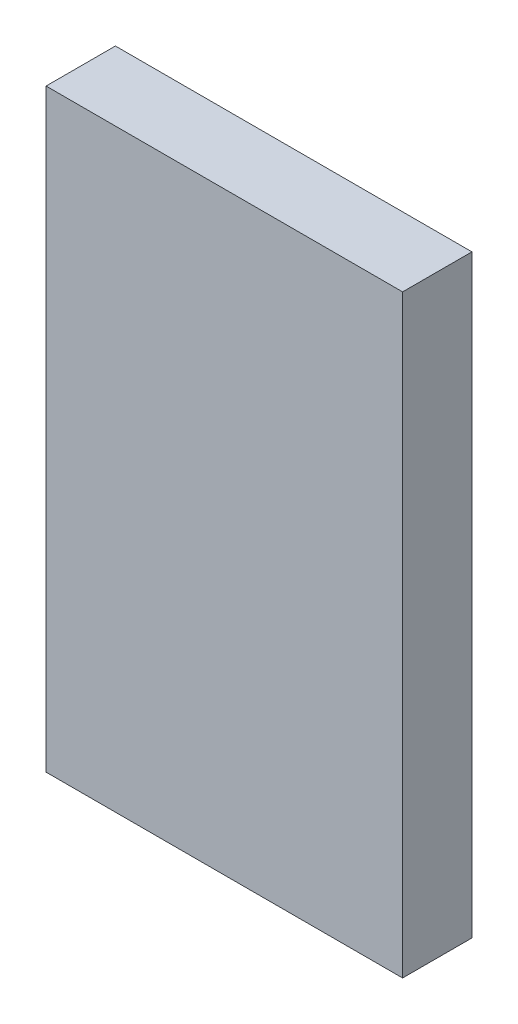
ISO-10303-21;
HEADER;
FILE_DESCRIPTION(('STEP AP214'),'2;1');
FILE_NAME('part.step','',(''),(''),'','','');
FILE_SCHEMA(('AUTOMOTIVE_DESIGN { 1 0 10303 214 1 1 1 1 }'));
ENDSEC;
DATA;
#1=APPLICATION_CONTEXT('core data for automotive mechanical design processes');
#2=APPLICATION_PROTOCOL_DEFINITION('international standard','automotive_design',2000,#1);
#3=PRODUCT_CONTEXT('',#1,'mechanical');
#4=PRODUCT('Part','Part','',(#3));
#5=PRODUCT_RELATED_PRODUCT_CATEGORY('part','',(#4));
#6=PRODUCT_DEFINITION_FORMATION('','',#4);
#7=PRODUCT_DEFINITION_CONTEXT('part definition',#1,'design');
#8=PRODUCT_DEFINITION('design','',#6,#7);
#9=PRODUCT_DEFINITION_SHAPE('','',#8);
#10=(LENGTH_UNIT() NAMED_UNIT(*) SI_UNIT(.MILLI.,.METRE.));
#11=(NAMED_UNIT(*) PLANE_ANGLE_UNIT() SI_UNIT($,.RADIAN.));
#12=(NAMED_UNIT(*) SI_UNIT($,.STERADIAN.) SOLID_ANGLE_UNIT());
#13=UNCERTAINTY_MEASURE_WITH_UNIT(LENGTH_MEASURE(1.E-05),#10,'distance_accuracy_value','');
#14=(GEOMETRIC_REPRESENTATION_CONTEXT(3) GLOBAL_UNCERTAINTY_ASSIGNED_CONTEXT((#13)) GLOBAL_UNIT_ASSIGNED_CONTEXT((#10,
#11,#12)) REPRESENTATION_CONTEXT('',''));
#15=CARTESIAN_POINT('',(0.,0.,0.));
#16=DIRECTION('',(0.,0.,1.));
#17=DIRECTION('',(1.,0.,0.));
#18=AXIS2_PLACEMENT_3D('',#15,#16,#17);
#19=CARTESIAN_POINT('',(-18.6232240437158,15.0833333333333,7.));
#20=DIRECTION('',(1.,0.,0.));
#21=DIRECTION('',(0.,1.,0.));
#22=AXIS2_PLACEMENT_3D('',#19,#20,#21);
#23=PLANE('',#22);
#24=DIRECTION('',(0.,-1.,0.));
#25=VECTOR('',#24,1.);
#26=CARTESIAN_POINT('',(-18.6232240437158,15.0833333333333,0.));
#27=LINE('',#26,#25);
#28=CARTESIAN_POINT('',(-18.6232240437158,15.0833333333333,0.));
#29=VERTEX_POINT('',#28);
#30=CARTESIAN_POINT('',(-18.6232240437158,-44.9166666666667,0.));
#31=VERTEX_POINT('',#30);
#32=EDGE_CURVE('E96',#29,#31,#27,.T.);
#33=ORIENTED_EDGE('',*,*,#32,.T.);
#34=DIRECTION('',(0.,0.,-1.));
#35=VECTOR('',#34,1.);
#36=CARTESIAN_POINT('',(-18.6232240437158,-44.9166666666667,7.));
#37=LINE('',#36,#35);
#38=CARTESIAN_POINT('',(-18.6232240437158,-44.9166666666667,7.));
#39=VERTEX_POINT('',#38);
#40=EDGE_CURVE('E11',#39,#31,#37,.T.);
#41=ORIENTED_EDGE('',*,*,#40,.F.);
#42=DIRECTION('',(0.,-1.,0.));
#43=VECTOR('',#42,1.);
#44=CARTESIAN_POINT('',(-18.6232240437158,15.0833333333333,7.));
#45=LINE('',#44,#43);
#46=CARTESIAN_POINT('',(-18.6232240437158,15.0833333333333,7.));
#47=VERTEX_POINT('',#46);
#48=EDGE_CURVE('E84',#47,#39,#45,.T.);
#49=ORIENTED_EDGE('',*,*,#48,.F.);
#50=DIRECTION('',(0.,0.,-1.));
#51=VECTOR('',#50,1.);
#52=CARTESIAN_POINT('',(-18.6232240437158,15.0833333333333,7.));
#53=LINE('',#52,#51);
#54=EDGE_CURVE('E92',#47,#29,#53,.T.);
#55=ORIENTED_EDGE('',*,*,#54,.T.);
#56=EDGE_LOOP('',(#33,#41,#49,#55));
#57=FACE_BOUND('',#56,.T.);
#58=ADVANCED_FACE('F33',(#57),#23,.F.);
#59=CARTESIAN_POINT('',(-18.6232240437158,-44.9166666666667,7.));
#60=DIRECTION('',(0.,1.,0.));
#61=DIRECTION('',(0.,0.,1.));
#62=AXIS2_PLACEMENT_3D('',#59,#60,#61);
#63=PLANE('',#62);
#64=DIRECTION('',(1.,0.,0.));
#65=VECTOR('',#64,1.);
#66=CARTESIAN_POINT('',(-18.6232240437158,-44.9166666666667,0.));
#67=LINE('',#66,#65);
#68=CARTESIAN_POINT('',(17.3767759562842,-44.9166666666667,0.));
#69=VERTEX_POINT('',#68);
#70=EDGE_CURVE('E88',#31,#69,#67,.T.);
#71=ORIENTED_EDGE('',*,*,#70,.T.);
#72=DIRECTION('',(0.,0.,-1.));
#73=VECTOR('',#72,1.);
#74=CARTESIAN_POINT('',(17.3767759562842,-44.9166666666667,7.));
#75=LINE('',#74,#73);
#76=CARTESIAN_POINT('',(17.3767759562842,-44.9166666666667,7.));
#77=VERTEX_POINT('',#76);
#78=EDGE_CURVE('E41',#77,#69,#75,.T.);
#79=ORIENTED_EDGE('',*,*,#78,.F.);
#80=DIRECTION('',(1.,0.,0.));
#81=VECTOR('',#80,1.);
#82=CARTESIAN_POINT('',(-18.6232240437158,-44.9166666666667,7.));
#83=LINE('',#82,#81);
#84=EDGE_CURVE('E79',#39,#77,#83,.T.);
#85=ORIENTED_EDGE('',*,*,#84,.F.);
#86=ORIENTED_EDGE('',*,*,#40,.T.);
#87=EDGE_LOOP('',(#71,#79,#85,#86));
#88=FACE_BOUND('',#87,.T.);
#89=ADVANCED_FACE('F87',(#88),#63,.F.);
#90=CARTESIAN_POINT('',(17.3767759562842,15.0833333333333,7.));
#91=DIRECTION('',(-1.,0.,0.));
#92=DIRECTION('',(0.,-1.,0.));
#93=AXIS2_PLACEMENT_3D('',#90,#91,#92);
#94=PLANE('',#93);
#95=DIRECTION('',(0.,1.,0.));
#96=VECTOR('',#95,1.);
#97=CARTESIAN_POINT('',(17.3767759562842,15.0833333333333,0.));
#98=LINE('',#97,#96);
#99=CARTESIAN_POINT('',(17.3767759562842,15.0833333333333,0.));
#100=VERTEX_POINT('',#99);
#101=EDGE_CURVE('E66',#69,#100,#98,.T.);
#102=ORIENTED_EDGE('',*,*,#101,.T.);
#103=DIRECTION('',(0.,0.,-1.));
#104=VECTOR('',#103,1.);
#105=CARTESIAN_POINT('',(17.3767759562842,15.0833333333333,7.));
#106=LINE('',#105,#104);
#107=CARTESIAN_POINT('',(17.3767759562842,15.0833333333333,7.));
#108=VERTEX_POINT('',#107);
#109=EDGE_CURVE('E89',#108,#100,#106,.T.);
#110=ORIENTED_EDGE('',*,*,#109,.F.);
#111=DIRECTION('',(0.,1.,0.));
#112=VECTOR('',#111,1.);
#113=CARTESIAN_POINT('',(17.3767759562842,15.0833333333333,7.));
#114=LINE('',#113,#112);
#115=EDGE_CURVE('E82',#77,#108,#114,.T.);
#116=ORIENTED_EDGE('',*,*,#115,.F.);
#117=ORIENTED_EDGE('',*,*,#78,.T.);
#118=EDGE_LOOP('',(#102,#110,#116,#117));
#119=FACE_BOUND('',#118,.T.);
#120=ADVANCED_FACE('F90',(#119),#94,.F.);
#121=CARTESIAN_POINT('',(-18.6232240437158,15.0833333333333,7.));
#122=DIRECTION('',(0.,-1.,0.));
#123=DIRECTION('',(0.,0.,-1.));
#124=AXIS2_PLACEMENT_3D('',#121,#122,#123);
#125=PLANE('',#124);
#126=DIRECTION('',(-1.,0.,0.));
#127=VECTOR('',#126,1.);
#128=CARTESIAN_POINT('',(-18.6232240437158,15.0833333333333,0.));
#129=LINE('',#128,#127);
#130=EDGE_CURVE('E72',#100,#29,#129,.T.);
#131=ORIENTED_EDGE('',*,*,#130,.T.);
#132=ORIENTED_EDGE('',*,*,#54,.F.);
#133=DIRECTION('',(-1.,0.,0.));
#134=VECTOR('',#133,1.);
#135=CARTESIAN_POINT('',(-18.6232240437158,15.0833333333333,7.));
#136=LINE('',#135,#134);
#137=EDGE_CURVE('E49',#108,#47,#136,.T.);
#138=ORIENTED_EDGE('',*,*,#137,.F.);
#139=ORIENTED_EDGE('',*,*,#109,.T.);
#140=EDGE_LOOP('',(#131,#132,#138,#139));
#141=FACE_BOUND('',#140,.T.);
#142=ADVANCED_FACE('F103',(#141),#125,.F.);
#143=CARTESIAN_POINT('',(0.,0.,7.));
#144=DIRECTION('',(0.,0.,1.));
#145=DIRECTION('',(1.,0.,0.));
#146=AXIS2_PLACEMENT_3D('',#143,#144,#145);
#147=PLANE('',#146);
#148=ORIENTED_EDGE('',*,*,#48,.T.);
#149=ORIENTED_EDGE('',*,*,#84,.T.);
#150=ORIENTED_EDGE('',*,*,#115,.T.);
#151=ORIENTED_EDGE('',*,*,#137,.T.);
#152=EDGE_LOOP('',(#148,#149,#150,#151));
#153=FACE_BOUND('',#152,.T.);
#154=ADVANCED_FACE('F80',(#153),#147,.T.);
#155=CARTESIAN_POINT('',(0.,0.,0.));
#156=DIRECTION('',(0.,0.,1.));
#157=DIRECTION('',(1.,0.,0.));
#158=AXIS2_PLACEMENT_3D('',#155,#156,#157);
#159=PLANE('',#158);
#160=ORIENTED_EDGE('',*,*,#32,.F.);
#161=ORIENTED_EDGE('',*,*,#130,.F.);
#162=ORIENTED_EDGE('',*,*,#101,.F.);
#163=ORIENTED_EDGE('',*,*,#70,.F.);
#164=EDGE_LOOP('',(#160,#161,#162,#163));
#165=FACE_BOUND('',#164,.T.);
#166=ADVANCED_FACE('F106',(#165),#159,.F.);
#167=CLOSED_SHELL('',(#58,#89,#120,#142,#154,#166));
#168=MANIFOLD_SOLID_BREP('B2',#167);
#169=ADVANCED_BREP_SHAPE_REPRESENTATION('',(#18,#168),#14);
#170=SHAPE_DEFINITION_REPRESENTATION(#9,#169);
ENDSEC;
END-ISO-10303-21;
